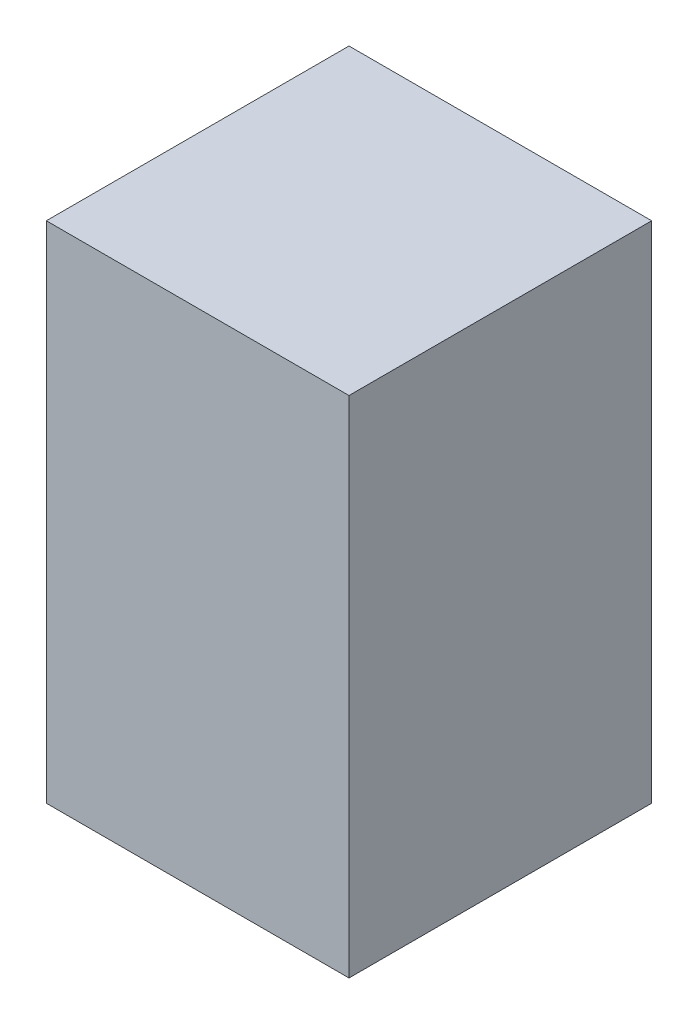
ISO-10303-21;
HEADER;
FILE_DESCRIPTION(('STEP AP214'),'2;1');
FILE_NAME('part.step','',(''),(''),'','','');
FILE_SCHEMA(('AUTOMOTIVE_DESIGN { 1 0 10303 214 1 1 1 1 }'));
ENDSEC;
DATA;
#1=APPLICATION_CONTEXT('core data for automotive mechanical design processes');
#2=APPLICATION_PROTOCOL_DEFINITION('international standard','automotive_design',2000,#1);
#3=PRODUCT_CONTEXT('',#1,'mechanical');
#4=PRODUCT('Part','Part','',(#3));
#5=PRODUCT_RELATED_PRODUCT_CATEGORY('part','',(#4));
#6=PRODUCT_DEFINITION_FORMATION('','',#4);
#7=PRODUCT_DEFINITION_CONTEXT('part definition',#1,'design');
#8=PRODUCT_DEFINITION('design','',#6,#7);
#9=PRODUCT_DEFINITION_SHAPE('','',#8);
#10=(LENGTH_UNIT() NAMED_UNIT(*) SI_UNIT(.MILLI.,.METRE.));
#11=(NAMED_UNIT(*) PLANE_ANGLE_UNIT() SI_UNIT($,.RADIAN.));
#12=(NAMED_UNIT(*) SI_UNIT($,.STERADIAN.) SOLID_ANGLE_UNIT());
#13=UNCERTAINTY_MEASURE_WITH_UNIT(LENGTH_MEASURE(1.E-05),#10,'distance_accuracy_value','');
#14=(GEOMETRIC_REPRESENTATION_CONTEXT(3) GLOBAL_UNCERTAINTY_ASSIGNED_CONTEXT((#13)) GLOBAL_UNIT_ASSIGNED_CONTEXT((#10,
#11,#12)) REPRESENTATION_CONTEXT('',''));
#15=CARTESIAN_POINT('',(0.,0.,0.));
#16=DIRECTION('',(0.,0.,1.));
#17=DIRECTION('',(1.,0.,0.));
#18=AXIS2_PLACEMENT_3D('',#15,#16,#17);
#19=CARTESIAN_POINT('',(30.,-50.,30.));
#20=DIRECTION('',(-1.,0.,0.));
#21=DIRECTION('',(0.,0.,1.));
#22=AXIS2_PLACEMENT_3D('',#19,#20,#21);
#23=PLANE('',#22);
#24=DIRECTION('',(0.,1.,0.));
#25=VECTOR('',#24,1.);
#26=CARTESIAN_POINT('',(30.,-50.,-30.));
#27=LINE('',#26,#25);
#28=CARTESIAN_POINT('',(30.,-50.,-30.));
#29=VERTEX_POINT('',#28);
#30=CARTESIAN_POINT('',(30.,50.,-30.));
#31=VERTEX_POINT('',#30);
#32=EDGE_CURVE('E100',#29,#31,#27,.T.);
#33=ORIENTED_EDGE('',*,*,#32,.T.);
#34=DIRECTION('',(0.,0.,-1.));
#35=VECTOR('',#34,1.);
#36=CARTESIAN_POINT('',(30.,50.,30.));
#37=LINE('',#36,#35);
#38=CARTESIAN_POINT('',(30.,50.,30.));
#39=VERTEX_POINT('',#38);
#40=EDGE_CURVE('E11',#39,#31,#37,.T.);
#41=ORIENTED_EDGE('',*,*,#40,.F.);
#42=DIRECTION('',(0.,1.,0.));
#43=VECTOR('',#42,1.);
#44=CARTESIAN_POINT('',(30.,-50.,30.));
#45=LINE('',#44,#43);
#46=CARTESIAN_POINT('',(30.,-50.,30.));
#47=VERTEX_POINT('',#46);
#48=EDGE_CURVE('E88',#47,#39,#45,.T.);
#49=ORIENTED_EDGE('',*,*,#48,.F.);
#50=DIRECTION('',(0.,0.,-1.));
#51=VECTOR('',#50,1.);
#52=CARTESIAN_POINT('',(30.,-50.,30.));
#53=LINE('',#52,#51);
#54=EDGE_CURVE('E96',#47,#29,#53,.T.);
#55=ORIENTED_EDGE('',*,*,#54,.T.);
#56=EDGE_LOOP('',(#33,#41,#49,#55));
#57=FACE_BOUND('',#56,.T.);
#58=ADVANCED_FACE('F37',(#57),#23,.F.);
#59=CARTESIAN_POINT('',(-30.,50.,30.));
#60=DIRECTION('',(0.,-1.,0.));
#61=DIRECTION('',(0.,0.,-1.));
#62=AXIS2_PLACEMENT_3D('',#59,#60,#61);
#63=PLANE('',#62);
#64=DIRECTION('',(-1.,0.,0.));
#65=VECTOR('',#64,1.);
#66=CARTESIAN_POINT('',(-30.,50.,-30.));
#67=LINE('',#66,#65);
#68=CARTESIAN_POINT('',(-30.,50.,-30.));
#69=VERTEX_POINT('',#68);
#70=EDGE_CURVE('E92',#31,#69,#67,.T.);
#71=ORIENTED_EDGE('',*,*,#70,.T.);
#72=DIRECTION('',(0.,0.,-1.));
#73=VECTOR('',#72,1.);
#74=CARTESIAN_POINT('',(-30.,50.,30.));
#75=LINE('',#74,#73);
#76=CARTESIAN_POINT('',(-30.,50.,30.));
#77=VERTEX_POINT('',#76);
#78=EDGE_CURVE('E45',#77,#69,#75,.T.);
#79=ORIENTED_EDGE('',*,*,#78,.F.);
#80=DIRECTION('',(-1.,0.,0.));
#81=VECTOR('',#80,1.);
#82=CARTESIAN_POINT('',(-30.,50.,30.));
#83=LINE('',#82,#81);
#84=EDGE_CURVE('E83',#39,#77,#83,.T.);
#85=ORIENTED_EDGE('',*,*,#84,.F.);
#86=ORIENTED_EDGE('',*,*,#40,.T.);
#87=EDGE_LOOP('',(#71,#79,#85,#86));
#88=FACE_BOUND('',#87,.T.);
#89=ADVANCED_FACE('F91',(#88),#63,.F.);
#90=CARTESIAN_POINT('',(-30.,-50.,30.));
#91=DIRECTION('',(1.,0.,0.));
#92=DIRECTION('',(0.,0.,-1.));
#93=AXIS2_PLACEMENT_3D('',#90,#91,#92);
#94=PLANE('',#93);
#95=DIRECTION('',(0.,-1.,0.));
#96=VECTOR('',#95,1.);
#97=CARTESIAN_POINT('',(-30.,-50.,-30.));
#98=LINE('',#97,#96);
#99=CARTESIAN_POINT('',(-30.,-50.,-30.));
#100=VERTEX_POINT('',#99);
#101=EDGE_CURVE('E70',#69,#100,#98,.T.);
#102=ORIENTED_EDGE('',*,*,#101,.T.);
#103=DIRECTION('',(0.,0.,-1.));
#104=VECTOR('',#103,1.);
#105=CARTESIAN_POINT('',(-30.,-50.,30.));
#106=LINE('',#105,#104);
#107=CARTESIAN_POINT('',(-30.,-50.,30.));
#108=VERTEX_POINT('',#107);
#109=EDGE_CURVE('E93',#108,#100,#106,.T.);
#110=ORIENTED_EDGE('',*,*,#109,.F.);
#111=DIRECTION('',(0.,-1.,0.));
#112=VECTOR('',#111,1.);
#113=CARTESIAN_POINT('',(-30.,-50.,30.));
#114=LINE('',#113,#112);
#115=EDGE_CURVE('E86',#77,#108,#114,.T.);
#116=ORIENTED_EDGE('',*,*,#115,.F.);
#117=ORIENTED_EDGE('',*,*,#78,.T.);
#118=EDGE_LOOP('',(#102,#110,#116,#117));
#119=FACE_BOUND('',#118,.T.);
#120=ADVANCED_FACE('F94',(#119),#94,.F.);
#121=CARTESIAN_POINT('',(-30.,-50.,30.));
#122=DIRECTION('',(0.,1.,0.));
#123=DIRECTION('',(0.,0.,1.));
#124=AXIS2_PLACEMENT_3D('',#121,#122,#123);
#125=PLANE('',#124);
#126=DIRECTION('',(1.,0.,0.));
#127=VECTOR('',#126,1.);
#128=CARTESIAN_POINT('',(-30.,-50.,-30.));
#129=LINE('',#128,#127);
#130=EDGE_CURVE('E76',#100,#29,#129,.T.);
#131=ORIENTED_EDGE('',*,*,#130,.T.);
#132=ORIENTED_EDGE('',*,*,#54,.F.);
#133=DIRECTION('',(1.,0.,0.));
#134=VECTOR('',#133,1.);
#135=CARTESIAN_POINT('',(-30.,-50.,30.));
#136=LINE('',#135,#134);
#137=EDGE_CURVE('E53',#108,#47,#136,.T.);
#138=ORIENTED_EDGE('',*,*,#137,.F.);
#139=ORIENTED_EDGE('',*,*,#109,.T.);
#140=EDGE_LOOP('',(#131,#132,#138,#139));
#141=FACE_BOUND('',#140,.T.);
#142=ADVANCED_FACE('F107',(#141),#125,.F.);
#143=CARTESIAN_POINT('',(0.,0.,30.));
#144=DIRECTION('',(0.,0.,-1.));
#145=DIRECTION('',(-1.,0.,0.));
#146=AXIS2_PLACEMENT_3D('',#143,#144,#145);
#147=PLANE('',#146);
#148=ORIENTED_EDGE('',*,*,#48,.T.);
#149=ORIENTED_EDGE('',*,*,#84,.T.);
#150=ORIENTED_EDGE('',*,*,#115,.T.);
#151=ORIENTED_EDGE('',*,*,#137,.T.);
#152=EDGE_LOOP('',(#148,#149,#150,#151));
#153=FACE_BOUND('',#152,.T.);
#154=ADVANCED_FACE('F84',(#153),#147,.F.);
#155=CARTESIAN_POINT('',(0.,0.,-30.));
#156=DIRECTION('',(0.,0.,-1.));
#157=DIRECTION('',(-1.,0.,0.));
#158=AXIS2_PLACEMENT_3D('',#155,#156,#157);
#159=PLANE('',#158);
#160=ORIENTED_EDGE('',*,*,#32,.F.);
#161=ORIENTED_EDGE('',*,*,#130,.F.);
#162=ORIENTED_EDGE('',*,*,#101,.F.);
#163=ORIENTED_EDGE('',*,*,#70,.F.);
#164=EDGE_LOOP('',(#160,#161,#162,#163));
#165=FACE_BOUND('',#164,.T.);
#166=ADVANCED_FACE('F110',(#165),#159,.T.);
#167=CLOSED_SHELL('',(#58,#89,#120,#142,#154,#166));
#168=MANIFOLD_SOLID_BREP('B2',#167);
#169=ADVANCED_BREP_SHAPE_REPRESENTATION('',(#18,#168),#14);
#170=SHAPE_DEFINITION_REPRESENTATION(#9,#169);
ENDSEC;
END-ISO-10303-21;
